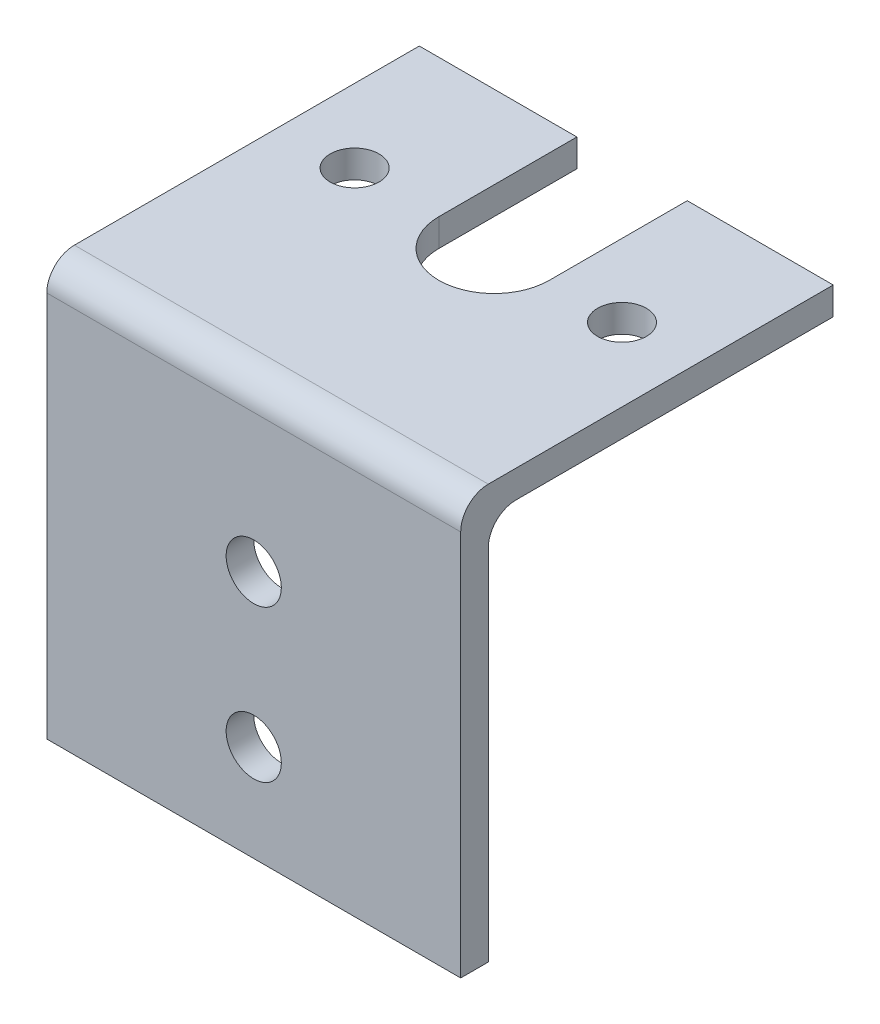
ISO-10303-21;
HEADER;
FILE_DESCRIPTION(('STEP AP214'),'2;1');
FILE_NAME('part.step','',(''),(''),'','','');
FILE_SCHEMA(('AUTOMOTIVE_DESIGN { 1 0 10303 214 1 1 1 1 }'));
ENDSEC;
DATA;
#1=APPLICATION_CONTEXT('core data for automotive mechanical design processes');
#2=APPLICATION_PROTOCOL_DEFINITION('international standard','automotive_design',2000,#1);
#3=PRODUCT_CONTEXT('',#1,'mechanical');
#4=PRODUCT('Part','Part','',(#3));
#5=PRODUCT_RELATED_PRODUCT_CATEGORY('part','',(#4));
#6=PRODUCT_DEFINITION_FORMATION('','',#4);
#7=PRODUCT_DEFINITION_CONTEXT('part definition',#1,'design');
#8=PRODUCT_DEFINITION('design','',#6,#7);
#9=PRODUCT_DEFINITION_SHAPE('','',#8);
#10=(LENGTH_UNIT() NAMED_UNIT(*) SI_UNIT(.MILLI.,.METRE.));
#11=(NAMED_UNIT(*) PLANE_ANGLE_UNIT() SI_UNIT($,.RADIAN.));
#12=(NAMED_UNIT(*) SI_UNIT($,.STERADIAN.) SOLID_ANGLE_UNIT());
#13=UNCERTAINTY_MEASURE_WITH_UNIT(LENGTH_MEASURE(1.E-05),#10,'distance_accuracy_value','');
#14=(GEOMETRIC_REPRESENTATION_CONTEXT(3) GLOBAL_UNCERTAINTY_ASSIGNED_CONTEXT((#13)) GLOBAL_UNIT_ASSIGNED_CONTEXT((#10,
#11,#12)) REPRESENTATION_CONTEXT('',''));
#15=CARTESIAN_POINT('',(0.,0.,0.));
#16=DIRECTION('',(0.,0.,1.));
#17=DIRECTION('',(1.,0.,0.));
#18=AXIS2_PLACEMENT_3D('',#15,#16,#17);
#19=CARTESIAN_POINT('',(0.,2.54,0.));
#20=DIRECTION('',(0.,1.,0.));
#21=DIRECTION('',(0.,0.,1.));
#22=AXIS2_PLACEMENT_3D('',#19,#20,#21);
#23=PLANE('',#22);
#24=CARTESIAN_POINT('',(-12.8396640387052,2.54,-4.07076813519034));
#25=DIRECTION('',(0.,1.,0.));
#26=DIRECTION('',(0.,0.,1.));
#27=AXIS2_PLACEMENT_3D('',#24,#25,#26);
#28=CIRCLE('',#27,2.24790000000002);
#29=CARTESIAN_POINT('',(-12.8396640387052,2.54,-1.82286813519033));
#30=VERTEX_POINT('',#29);
#31=EDGE_CURVE('E168',#30,#30,#28,.T.);
#32=ORIENTED_EDGE('',*,*,#31,.F.);
#33=EDGE_LOOP('',(#32));
#34=FACE_BOUND('',#33,.T.);
#35=DIRECTION('',(0.,0.,1.));
#36=VECTOR('',#35,1.);
#37=CARTESIAN_POINT('',(-19.5833640387052,2.54,-16.7707681351903));
#38=LINE('',#37,#36);
#39=CARTESIAN_POINT('',(-19.5833640387052,2.54,-16.7707681351903));
#40=VERTEX_POINT('',#39);
#41=CARTESIAN_POINT('',(-19.5833640387052,2.54,14.9792318648097));
#42=VERTEX_POINT('',#41);
#43=EDGE_CURVE('E186',#40,#42,#38,.T.);
#44=ORIENTED_EDGE('',*,*,#43,.T.);
#45=DIRECTION('',(-1.,0.,0.));
#46=VECTOR('',#45,1.);
#47=CARTESIAN_POINT('',(0.,2.54,14.9792318648097));
#48=LINE('',#47,#46);
#49=CARTESIAN_POINT('',(18.5166359612948,2.54,14.9792318648097));
#50=VERTEX_POINT('',#49);
#51=EDGE_CURVE('E44',#42,#50,#48,.F.);
#52=ORIENTED_EDGE('',*,*,#51,.T.);
#53=DIRECTION('',(0.,0.,-1.));
#54=VECTOR('',#53,1.);
#55=CARTESIAN_POINT('',(18.5166359612948,2.54,-16.7707681351903));
#56=LINE('',#55,#54);
#57=CARTESIAN_POINT('',(18.5166359612948,2.54,-16.7707681351903));
#58=VERTEX_POINT('',#57);
#59=EDGE_CURVE('E174',#50,#58,#56,.T.);
#60=ORIENTED_EDGE('',*,*,#59,.T.);
#61=DIRECTION('',(-1.,0.,0.));
#62=VECTOR('',#61,1.);
#63=CARTESIAN_POINT('',(5.08,2.54,-16.7707681351903));
#64=LINE('',#63,#62);
#65=CARTESIAN_POINT('',(5.08,2.54,-16.7707681351903));
#66=VERTEX_POINT('',#65);
#67=EDGE_CURVE('E176',#58,#66,#64,.T.);
#68=ORIENTED_EDGE('',*,*,#67,.T.);
#69=DIRECTION('',(0.,0.,1.));
#70=VECTOR('',#69,1.);
#71=CARTESIAN_POINT('',(5.08,2.54,1.00923186480966));
#72=LINE('',#71,#70);
#73=CARTESIAN_POINT('',(5.08,2.54,-4.07076813519034));
#74=VERTEX_POINT('',#73);
#75=EDGE_CURVE('E179',#66,#74,#72,.T.);
#76=ORIENTED_EDGE('',*,*,#75,.T.);
#77=CARTESIAN_POINT('',(0.,2.54,-4.07076813519034));
#78=DIRECTION('',(0.,1.,0.));
#79=DIRECTION('',(0.,0.,1.));
#80=AXIS2_PLACEMENT_3D('',#77,#78,#79);
#81=CIRCLE('',#80,5.08);
#82=CARTESIAN_POINT('',(0.,2.54,1.00923186480966));
#83=VERTEX_POINT('',#82);
#84=EDGE_CURVE('E219',#74,#83,#81,.F.);
#85=ORIENTED_EDGE('',*,*,#84,.T.);
#86=CARTESIAN_POINT('',(0.,2.54,-4.07076813519034));
#87=DIRECTION('',(0.,1.,0.));
#88=DIRECTION('',(0.,0.,1.));
#89=AXIS2_PLACEMENT_3D('',#86,#87,#88);
#90=CIRCLE('',#89,5.08);
#91=CARTESIAN_POINT('',(-5.08,2.54,-4.07076813519034));
#92=VERTEX_POINT('',#91);
#93=EDGE_CURVE('E223',#83,#92,#90,.F.);
#94=ORIENTED_EDGE('',*,*,#93,.T.);
#95=DIRECTION('',(0.,0.,-1.));
#96=VECTOR('',#95,1.);
#97=CARTESIAN_POINT('',(-5.08,2.54,1.00923186480966));
#98=LINE('',#97,#96);
#99=CARTESIAN_POINT('',(-5.08,2.54,-16.7707681351903));
#100=VERTEX_POINT('',#99);
#101=EDGE_CURVE('E182',#92,#100,#98,.T.);
#102=ORIENTED_EDGE('',*,*,#101,.T.);
#103=DIRECTION('',(-1.,0.,0.));
#104=VECTOR('',#103,1.);
#105=CARTESIAN_POINT('',(-19.5833640387052,2.54,-16.7707681351903));
#106=LINE('',#105,#104);
#107=EDGE_CURVE('E184',#100,#40,#106,.T.);
#108=ORIENTED_EDGE('',*,*,#107,.T.);
#109=EDGE_LOOP('',(#44,#52,#60,#68,#76,#85,#94,#102,#108));
#110=FACE_BOUND('',#109,.T.);
#111=CARTESIAN_POINT('',(11.7729359612948,2.54,-4.07076813519034));
#112=DIRECTION('',(0.,1.,0.));
#113=DIRECTION('',(0.,0.,1.));
#114=AXIS2_PLACEMENT_3D('',#111,#112,#113);
#115=CIRCLE('',#114,2.2479);
#116=CARTESIAN_POINT('',(11.7729359612948,2.54,-1.82286813519034));
#117=VERTEX_POINT('',#116);
#118=EDGE_CURVE('E162',#117,#117,#115,.T.);
#119=ORIENTED_EDGE('',*,*,#118,.F.);
#120=EDGE_LOOP('',(#119));
#121=FACE_BOUND('',#120,.T.);
#122=ADVANCED_FACE('F36',(#34,#110,#121),#23,.T.);
#123=CARTESIAN_POINT('',(0.,0.,0.));
#124=DIRECTION('',(0.,1.,0.));
#125=DIRECTION('',(0.,0.,1.));
#126=AXIS2_PLACEMENT_3D('',#123,#124,#125);
#127=PLANE('',#126);
#128=DIRECTION('',(0.,0.,-1.));
#129=VECTOR('',#128,1.);
#130=CARTESIAN_POINT('',(18.5166359612948,0.,-16.7707681351903));
#131=LINE('',#130,#129);
#132=CARTESIAN_POINT('',(18.5166359612948,0.,12.4392318648097));
#133=VERTEX_POINT('',#132);
#134=CARTESIAN_POINT('',(18.5166359612948,0.,-16.7707681351903));
#135=VERTEX_POINT('',#134);
#136=EDGE_CURVE('E171',#133,#135,#131,.T.);
#137=ORIENTED_EDGE('',*,*,#136,.F.);
#138=DIRECTION('',(1.,0.,0.));
#139=VECTOR('',#138,1.);
#140=CARTESIAN_POINT('',(-19.5833640387052,0.,12.4392318648097));
#141=LINE('',#140,#139);
#142=CARTESIAN_POINT('',(-19.5833640387052,0.,12.4392318648097));
#143=VERTEX_POINT('',#142);
#144=EDGE_CURVE('E228',#133,#143,#141,.F.);
#145=ORIENTED_EDGE('',*,*,#144,.T.);
#146=DIRECTION('',(0.,0.,1.));
#147=VECTOR('',#146,1.);
#148=CARTESIAN_POINT('',(-19.5833640387052,0.,-16.7707681351903));
#149=LINE('',#148,#147);
#150=CARTESIAN_POINT('',(-19.5833640387052,0.,-16.7707681351903));
#151=VERTEX_POINT('',#150);
#152=EDGE_CURVE('E177',#151,#143,#149,.T.);
#153=ORIENTED_EDGE('',*,*,#152,.F.);
#154=DIRECTION('',(-1.,0.,0.));
#155=VECTOR('',#154,1.);
#156=CARTESIAN_POINT('',(-19.5833640387052,0.,-16.7707681351903));
#157=LINE('',#156,#155);
#158=CARTESIAN_POINT('',(-5.08,0.,-16.7707681351903));
#159=VERTEX_POINT('',#158);
#160=EDGE_CURVE('E197',#159,#151,#157,.T.);
#161=ORIENTED_EDGE('',*,*,#160,.F.);
#162=DIRECTION('',(0.,0.,-1.));
#163=VECTOR('',#162,1.);
#164=CARTESIAN_POINT('',(-5.08,0.,1.00923186480966));
#165=LINE('',#164,#163);
#166=CARTESIAN_POINT('',(-5.08,0.,-4.07076813519034));
#167=VERTEX_POINT('',#166);
#168=EDGE_CURVE('E195',#167,#159,#165,.T.);
#169=ORIENTED_EDGE('',*,*,#168,.F.);
#170=CARTESIAN_POINT('',(0.,0.,-4.07076813519034));
#171=DIRECTION('',(0.,1.,0.));
#172=DIRECTION('',(0.,0.,1.));
#173=AXIS2_PLACEMENT_3D('',#170,#171,#172);
#174=CIRCLE('',#173,5.08);
#175=CARTESIAN_POINT('',(0.,0.,1.00923186480966));
#176=VERTEX_POINT('',#175);
#177=EDGE_CURVE('E221',#167,#176,#174,.T.);
#178=ORIENTED_EDGE('',*,*,#177,.T.);
#179=CARTESIAN_POINT('',(0.,0.,-4.07076813519034));
#180=DIRECTION('',(0.,1.,0.));
#181=DIRECTION('',(0.,0.,1.));
#182=AXIS2_PLACEMENT_3D('',#179,#180,#181);
#183=CIRCLE('',#182,5.08);
#184=CARTESIAN_POINT('',(5.08,0.,-4.07076813519034));
#185=VERTEX_POINT('',#184);
#186=EDGE_CURVE('E217',#176,#185,#183,.T.);
#187=ORIENTED_EDGE('',*,*,#186,.T.);
#188=DIRECTION('',(0.,0.,1.));
#189=VECTOR('',#188,1.);
#190=CARTESIAN_POINT('',(5.08,0.,1.00923186480966));
#191=LINE('',#190,#189);
#192=CARTESIAN_POINT('',(5.08,0.,-16.7707681351903));
#193=VERTEX_POINT('',#192);
#194=EDGE_CURVE('E192',#193,#185,#191,.T.);
#195=ORIENTED_EDGE('',*,*,#194,.F.);
#196=DIRECTION('',(-1.,0.,0.));
#197=VECTOR('',#196,1.);
#198=CARTESIAN_POINT('',(5.08,0.,-16.7707681351903));
#199=LINE('',#198,#197);
#200=EDGE_CURVE('E190',#135,#193,#199,.T.);
#201=ORIENTED_EDGE('',*,*,#200,.F.);
#202=EDGE_LOOP('',(#137,#145,#153,#161,#169,#178,#187,#195,#201));
#203=FACE_BOUND('',#202,.T.);
#204=CARTESIAN_POINT('',(-12.8396640387052,0.,-4.07076813519034));
#205=DIRECTION('',(0.,1.,0.));
#206=DIRECTION('',(0.,0.,1.));
#207=AXIS2_PLACEMENT_3D('',#204,#205,#206);
#208=CIRCLE('',#207,2.24790000000002);
#209=CARTESIAN_POINT('',(-12.8396640387052,0.,-1.82286813519033));
#210=VERTEX_POINT('',#209);
#211=EDGE_CURVE('E165',#210,#210,#208,.T.);
#212=ORIENTED_EDGE('',*,*,#211,.T.);
#213=EDGE_LOOP('',(#212));
#214=FACE_BOUND('',#213,.T.);
#215=CARTESIAN_POINT('',(11.7729359612948,0.,-4.07076813519034));
#216=DIRECTION('',(0.,1.,0.));
#217=DIRECTION('',(0.,0.,1.));
#218=AXIS2_PLACEMENT_3D('',#215,#216,#217);
#219=CIRCLE('',#218,2.2479);
#220=CARTESIAN_POINT('',(11.7729359612948,0.,-1.82286813519034));
#221=VERTEX_POINT('',#220);
#222=EDGE_CURVE('E157',#221,#221,#219,.T.);
#223=ORIENTED_EDGE('',*,*,#222,.T.);
#224=EDGE_LOOP('',(#223));
#225=FACE_BOUND('',#224,.T.);
#226=ADVANCED_FACE('F254',(#203,#214,#225),#127,.F.);
#227=CARTESIAN_POINT('',(18.5166359612948,2.54,-16.7707681351903));
#228=DIRECTION('',(-1.,0.,0.));
#229=DIRECTION('',(0.,0.,1.));
#230=AXIS2_PLACEMENT_3D('',#227,#228,#229);
#231=PLANE('',#230);
#232=ORIENTED_EDGE('',*,*,#59,.F.);
#233=CARTESIAN_POINT('',(18.5166359612948,0.,14.9792318648097));
#234=DIRECTION('',(-1.,0.,0.));
#235=DIRECTION('',(0.,0.,1.));
#236=AXIS2_PLACEMENT_3D('',#233,#234,#235);
#237=CIRCLE('',#236,2.54);
#238=CARTESIAN_POINT('',(18.5166359612948,0.,17.5192318648097));
#239=VERTEX_POINT('',#238);
#240=EDGE_CURVE('E11',#50,#239,#237,.F.);
#241=ORIENTED_EDGE('',*,*,#240,.T.);
#242=DIRECTION('',(0.,1.,0.));
#243=VECTOR('',#242,1.);
#244=CARTESIAN_POINT('',(18.5166359612948,2.54,17.5192318648097));
#245=LINE('',#244,#243);
#246=CARTESIAN_POINT('',(18.5166359612948,-35.56,17.5192318648097));
#247=VERTEX_POINT('',#246);
#248=EDGE_CURVE('E148',#247,#239,#245,.T.);
#249=ORIENTED_EDGE('',*,*,#248,.F.);
#250=DIRECTION('',(0.,0.,-1.));
#251=VECTOR('',#250,1.);
#252=CARTESIAN_POINT('',(18.5166359612948,-35.56,17.5192318648097));
#253=LINE('',#252,#251);
#254=CARTESIAN_POINT('',(18.5166359612948,-35.56,14.9792318648097));
#255=VERTEX_POINT('',#254);
#256=EDGE_CURVE('E146',#247,#255,#253,.T.);
#257=ORIENTED_EDGE('',*,*,#256,.T.);
#258=DIRECTION('',(0.,1.,0.));
#259=VECTOR('',#258,1.);
#260=CARTESIAN_POINT('',(18.5166359612948,2.54,14.9792318648097));
#261=LINE('',#260,#259);
#262=CARTESIAN_POINT('',(18.5166359612948,-2.54,14.9792318648097));
#263=VERTEX_POINT('',#262);
#264=EDGE_CURVE('E139',#255,#263,#261,.T.);
#265=ORIENTED_EDGE('',*,*,#264,.T.);
#266=CARTESIAN_POINT('',(18.5166359612948,-2.54,12.4392318648097));
#267=DIRECTION('',(-1.,0.,0.));
#268=DIRECTION('',(0.,0.,1.));
#269=AXIS2_PLACEMENT_3D('',#266,#267,#268);
#270=CIRCLE('',#269,2.54);
#271=EDGE_CURVE('E230',#263,#133,#270,.T.);
#272=ORIENTED_EDGE('',*,*,#271,.T.);
#273=ORIENTED_EDGE('',*,*,#136,.T.);
#274=DIRECTION('',(0.,-1.,0.));
#275=VECTOR('',#274,1.);
#276=CARTESIAN_POINT('',(18.5166359612948,2.54,-16.7707681351903));
#277=LINE('',#276,#275);
#278=EDGE_CURVE('E209',#58,#135,#277,.T.);
#279=ORIENTED_EDGE('',*,*,#278,.F.);
#280=EDGE_LOOP('',(#232,#241,#249,#257,#265,#272,#273,#279));
#281=FACE_BOUND('',#280,.T.);
#282=ADVANCED_FACE('F250',(#281),#231,.F.);
#283=CARTESIAN_POINT('',(5.08,2.54,-16.7707681351903));
#284=DIRECTION('',(0.,0.,1.));
#285=DIRECTION('',(1.,0.,0.));
#286=AXIS2_PLACEMENT_3D('',#283,#284,#285);
#287=PLANE('',#286);
#288=ORIENTED_EDGE('',*,*,#200,.T.);
#289=DIRECTION('',(0.,-1.,0.));
#290=VECTOR('',#289,1.);
#291=CARTESIAN_POINT('',(5.08,2.54,-16.7707681351903));
#292=LINE('',#291,#290);
#293=EDGE_CURVE('E206',#66,#193,#292,.T.);
#294=ORIENTED_EDGE('',*,*,#293,.F.);
#295=ORIENTED_EDGE('',*,*,#67,.F.);
#296=ORIENTED_EDGE('',*,*,#278,.T.);
#297=EDGE_LOOP('',(#288,#294,#295,#296));
#298=FACE_BOUND('',#297,.T.);
#299=ADVANCED_FACE('F260',(#298),#287,.F.);
#300=CARTESIAN_POINT('',(5.08,2.54,1.00923186480966));
#301=DIRECTION('',(1.,0.,0.));
#302=DIRECTION('',(0.,0.,-1.));
#303=AXIS2_PLACEMENT_3D('',#300,#301,#302);
#304=PLANE('',#303);
#305=ORIENTED_EDGE('',*,*,#194,.T.);
#306=DIRECTION('',(0.,-1.,0.));
#307=VECTOR('',#306,1.);
#308=CARTESIAN_POINT('',(5.08,2.54,-4.07076813519034));
#309=LINE('',#308,#307);
#310=EDGE_CURVE('E212',#185,#74,#309,.F.);
#311=ORIENTED_EDGE('',*,*,#310,.T.);
#312=ORIENTED_EDGE('',*,*,#75,.F.);
#313=ORIENTED_EDGE('',*,*,#293,.T.);
#314=EDGE_LOOP('',(#305,#311,#312,#313));
#315=FACE_BOUND('',#314,.T.);
#316=ADVANCED_FACE('F289',(#315),#304,.F.);
#317=CARTESIAN_POINT('',(-5.08,2.54,1.00923186480966));
#318=DIRECTION('',(-1.,0.,0.));
#319=DIRECTION('',(0.,0.,1.));
#320=AXIS2_PLACEMENT_3D('',#317,#318,#319);
#321=PLANE('',#320);
#322=ORIENTED_EDGE('',*,*,#101,.F.);
#323=DIRECTION('',(0.,-1.,0.));
#324=VECTOR('',#323,1.);
#325=CARTESIAN_POINT('',(-5.08,0.,-4.07076813519034));
#326=LINE('',#325,#324);
#327=EDGE_CURVE('E215',#92,#167,#326,.T.);
#328=ORIENTED_EDGE('',*,*,#327,.T.);
#329=ORIENTED_EDGE('',*,*,#168,.T.);
#330=DIRECTION('',(0.,-1.,0.));
#331=VECTOR('',#330,1.);
#332=CARTESIAN_POINT('',(-5.08,2.54,-16.7707681351903));
#333=LINE('',#332,#331);
#334=EDGE_CURVE('E203',#100,#159,#333,.T.);
#335=ORIENTED_EDGE('',*,*,#334,.F.);
#336=EDGE_LOOP('',(#322,#328,#329,#335));
#337=FACE_BOUND('',#336,.T.);
#338=ADVANCED_FACE('F285',(#337),#321,.F.);
#339=CARTESIAN_POINT('',(-19.5833640387052,2.54,-16.7707681351903));
#340=DIRECTION('',(0.,0.,1.));
#341=DIRECTION('',(1.,0.,0.));
#342=AXIS2_PLACEMENT_3D('',#339,#340,#341);
#343=PLANE('',#342);
#344=ORIENTED_EDGE('',*,*,#160,.T.);
#345=DIRECTION('',(0.,-1.,0.));
#346=VECTOR('',#345,1.);
#347=CARTESIAN_POINT('',(-19.5833640387052,2.54,-16.7707681351903));
#348=LINE('',#347,#346);
#349=EDGE_CURVE('E188',#40,#151,#348,.T.);
#350=ORIENTED_EDGE('',*,*,#349,.F.);
#351=ORIENTED_EDGE('',*,*,#107,.F.);
#352=ORIENTED_EDGE('',*,*,#334,.T.);
#353=EDGE_LOOP('',(#344,#350,#351,#352));
#354=FACE_BOUND('',#353,.T.);
#355=ADVANCED_FACE('F282',(#354),#343,.F.);
#356=CARTESIAN_POINT('',(-19.5833640387052,2.54,-16.7707681351903));
#357=DIRECTION('',(1.,0.,0.));
#358=DIRECTION('',(0.,0.,-1.));
#359=AXIS2_PLACEMENT_3D('',#356,#357,#358);
#360=PLANE('',#359);
#361=DIRECTION('',(0.,-1.,0.));
#362=VECTOR('',#361,1.);
#363=CARTESIAN_POINT('',(-19.5833640387052,2.54,17.5192318648097));
#364=LINE('',#363,#362);
#365=CARTESIAN_POINT('',(-19.5833640387052,0.,17.5192318648097));
#366=VERTEX_POINT('',#365);
#367=CARTESIAN_POINT('',(-19.5833640387052,-35.56,17.5192318648097));
#368=VERTEX_POINT('',#367);
#369=EDGE_CURVE('E129',#366,#368,#364,.T.);
#370=ORIENTED_EDGE('',*,*,#369,.F.);
#371=CARTESIAN_POINT('',(-19.5833640387052,0.,14.9792318648097));
#372=DIRECTION('',(1.,0.,0.));
#373=DIRECTION('',(0.,0.,-1.));
#374=AXIS2_PLACEMENT_3D('',#371,#372,#373);
#375=CIRCLE('',#374,2.54);
#376=EDGE_CURVE('E58',#366,#42,#375,.F.);
#377=ORIENTED_EDGE('',*,*,#376,.T.);
#378=ORIENTED_EDGE('',*,*,#43,.F.);
#379=ORIENTED_EDGE('',*,*,#349,.T.);
#380=ORIENTED_EDGE('',*,*,#152,.T.);
#381=CARTESIAN_POINT('',(-19.5833640387052,-2.54,12.4392318648097));
#382=DIRECTION('',(1.,0.,0.));
#383=DIRECTION('',(0.,0.,-1.));
#384=AXIS2_PLACEMENT_3D('',#381,#382,#383);
#385=CIRCLE('',#384,2.54);
#386=CARTESIAN_POINT('',(-19.5833640387052,-2.54,14.9792318648097));
#387=VERTEX_POINT('',#386);
#388=EDGE_CURVE('E232',#143,#387,#385,.T.);
#389=ORIENTED_EDGE('',*,*,#388,.T.);
#390=DIRECTION('',(0.,-1.,0.));
#391=VECTOR('',#390,1.);
#392=CARTESIAN_POINT('',(-19.5833640387052,2.54,14.9792318648097));
#393=LINE('',#392,#391);
#394=CARTESIAN_POINT('',(-19.5833640387052,-35.56,14.9792318648097));
#395=VERTEX_POINT('',#394);
#396=EDGE_CURVE('E152',#387,#395,#393,.T.);
#397=ORIENTED_EDGE('',*,*,#396,.T.);
#398=DIRECTION('',(0.,0.,-1.));
#399=VECTOR('',#398,1.);
#400=CARTESIAN_POINT('',(-19.5833640387052,-35.56,17.5192318648097));
#401=LINE('',#400,#399);
#402=EDGE_CURVE('E144',#368,#395,#401,.T.);
#403=ORIENTED_EDGE('',*,*,#402,.F.);
#404=EDGE_LOOP('',(#370,#377,#378,#379,#380,#389,#397,#403));
#405=FACE_BOUND('',#404,.T.);
#406=ADVANCED_FACE('F150',(#405),#360,.F.);
#407=CARTESIAN_POINT('',(-12.8396640387052,2.54,-4.07076813519034));
#408=DIRECTION('',(0.,-1.,0.));
#409=DIRECTION('',(0.,0.,-1.));
#410=AXIS2_PLACEMENT_3D('',#407,#408,#409);
#411=CYLINDRICAL_SURFACE('',#410,2.24790000000002);
#412=ORIENTED_EDGE('',*,*,#31,.T.);
#413=EDGE_LOOP('',(#412));
#414=FACE_BOUND('',#413,.T.);
#415=ORIENTED_EDGE('',*,*,#211,.F.);
#416=EDGE_LOOP('',(#415));
#417=FACE_BOUND('',#416,.T.);
#418=ADVANCED_FACE('F277',(#414,#417),#411,.F.);
#419=CARTESIAN_POINT('',(11.7729359612948,2.54,-4.07076813519034));
#420=DIRECTION('',(0.,-1.,0.));
#421=DIRECTION('',(0.,0.,-1.));
#422=AXIS2_PLACEMENT_3D('',#419,#420,#421);
#423=CYLINDRICAL_SURFACE('',#422,2.2479);
#424=ORIENTED_EDGE('',*,*,#118,.T.);
#425=EDGE_LOOP('',(#424));
#426=FACE_BOUND('',#425,.T.);
#427=ORIENTED_EDGE('',*,*,#222,.F.);
#428=EDGE_LOOP('',(#427));
#429=FACE_BOUND('',#428,.T.);
#430=ADVANCED_FACE('F304',(#426,#429),#423,.F.);
#431=CARTESIAN_POINT('',(0.,2.54,-4.07076813519034));
#432=DIRECTION('',(0.,1.,0.));
#433=DIRECTION('',(0.,0.,1.));
#434=AXIS2_PLACEMENT_3D('',#431,#432,#433);
#435=CYLINDRICAL_SURFACE('',#434,5.08);
#436=ORIENTED_EDGE('',*,*,#327,.F.);
#437=ORIENTED_EDGE('',*,*,#93,.F.);
#438=DIRECTION('',(0.,-1.,0.));
#439=VECTOR('',#438,1.);
#440=CARTESIAN_POINT('',(0.,2.54,1.00923186480966));
#441=LINE('',#440,#439);
#442=EDGE_CURVE('E154',#176,#83,#441,.F.);
#443=ORIENTED_EDGE('',*,*,#442,.F.);
#444=ORIENTED_EDGE('',*,*,#177,.F.);
#445=EDGE_LOOP('',(#436,#437,#443,#444));
#446=FACE_BOUND('',#445,.T.);
#447=ADVANCED_FACE('F301',(#446),#435,.F.);
#448=CARTESIAN_POINT('',(0.,2.54,-4.07076813519034));
#449=DIRECTION('',(0.,1.,0.));
#450=DIRECTION('',(0.,0.,1.));
#451=AXIS2_PLACEMENT_3D('',#448,#449,#450);
#452=CYLINDRICAL_SURFACE('',#451,5.08);
#453=ORIENTED_EDGE('',*,*,#84,.F.);
#454=ORIENTED_EDGE('',*,*,#310,.F.);
#455=ORIENTED_EDGE('',*,*,#186,.F.);
#456=ORIENTED_EDGE('',*,*,#442,.T.);
#457=EDGE_LOOP('',(#453,#454,#455,#456));
#458=FACE_BOUND('',#457,.T.);
#459=ADVANCED_FACE('F298',(#458),#452,.F.);
#460=CARTESIAN_POINT('',(0.,0.,14.9792318648097));
#461=DIRECTION('',(0.,0.,1.));
#462=DIRECTION('',(1.,0.,0.));
#463=AXIS2_PLACEMENT_3D('',#460,#461,#462);
#464=PLANE('',#463);
#465=CARTESIAN_POINT('',(-0.533364038705207,-12.7,14.9792318648097));
#466=DIRECTION('',(0.,0.,1.));
#467=DIRECTION('',(1.,0.,0.));
#468=AXIS2_PLACEMENT_3D('',#465,#466,#467);
#469=CIRCLE('',#468,2.54);
#470=CARTESIAN_POINT('',(2.00663596129479,-12.7,14.9792318648097));
#471=VERTEX_POINT('',#470);
#472=EDGE_CURVE('E358',#471,#471,#469,.T.);
#473=ORIENTED_EDGE('',*,*,#472,.T.);
#474=EDGE_LOOP('',(#473));
#475=FACE_BOUND('',#474,.T.);
#476=CARTESIAN_POINT('',(-0.533364038705207,-26.67,14.9792318648097));
#477=DIRECTION('',(0.,0.,1.));
#478=DIRECTION('',(1.,0.,0.));
#479=AXIS2_PLACEMENT_3D('',#476,#477,#478);
#480=CIRCLE('',#479,2.54);
#481=CARTESIAN_POINT('',(2.0066359612948,-26.67,14.9792318648097));
#482=VERTEX_POINT('',#481);
#483=EDGE_CURVE('E355',#482,#482,#480,.T.);
#484=ORIENTED_EDGE('',*,*,#483,.T.);
#485=EDGE_LOOP('',(#484));
#486=FACE_BOUND('',#485,.T.);
#487=ORIENTED_EDGE('',*,*,#396,.F.);
#488=DIRECTION('',(1.,0.,0.));
#489=VECTOR('',#488,1.);
#490=CARTESIAN_POINT('',(18.5166359612948,-2.54,14.9792318648097));
#491=LINE('',#490,#489);
#492=EDGE_CURVE('E224',#387,#263,#491,.T.);
#493=ORIENTED_EDGE('',*,*,#492,.T.);
#494=ORIENTED_EDGE('',*,*,#264,.F.);
#495=DIRECTION('',(1.,0.,0.));
#496=VECTOR('',#495,1.);
#497=CARTESIAN_POINT('',(-19.5833640387052,-35.56,14.9792318648097));
#498=LINE('',#497,#496);
#499=EDGE_CURVE('E244',#395,#255,#498,.T.);
#500=ORIENTED_EDGE('',*,*,#499,.F.);
#501=EDGE_LOOP('',(#487,#493,#494,#500));
#502=FACE_BOUND('',#501,.T.);
#503=ADVANCED_FACE('F241',(#475,#486,#502),#464,.F.);
#504=CARTESIAN_POINT('',(0.,0.,17.5192318648097));
#505=DIRECTION('',(0.,0.,1.));
#506=DIRECTION('',(1.,0.,0.));
#507=AXIS2_PLACEMENT_3D('',#504,#505,#506);
#508=PLANE('',#507);
#509=CARTESIAN_POINT('',(-0.533364038705207,-12.7,17.5192318648097));
#510=DIRECTION('',(0.,0.,1.));
#511=DIRECTION('',(1.,0.,0.));
#512=AXIS2_PLACEMENT_3D('',#509,#510,#511);
#513=CIRCLE('',#512,2.54);
#514=CARTESIAN_POINT('',(2.00663596129479,-12.7,17.5192318648097));
#515=VERTEX_POINT('',#514);
#516=EDGE_CURVE('E245',#515,#515,#513,.T.);
#517=ORIENTED_EDGE('',*,*,#516,.F.);
#518=EDGE_LOOP('',(#517));
#519=FACE_BOUND('',#518,.T.);
#520=ORIENTED_EDGE('',*,*,#248,.T.);
#521=DIRECTION('',(-1.,0.,0.));
#522=VECTOR('',#521,1.);
#523=CARTESIAN_POINT('',(0.,0.,17.5192318648097));
#524=LINE('',#523,#522);
#525=EDGE_CURVE('E137',#239,#366,#524,.T.);
#526=ORIENTED_EDGE('',*,*,#525,.T.);
#527=ORIENTED_EDGE('',*,*,#369,.T.);
#528=DIRECTION('',(1.,0.,0.));
#529=VECTOR('',#528,1.);
#530=CARTESIAN_POINT('',(-19.5833640387052,-35.56,17.5192318648097));
#531=LINE('',#530,#529);
#532=EDGE_CURVE('E134',#368,#247,#531,.T.);
#533=ORIENTED_EDGE('',*,*,#532,.T.);
#534=EDGE_LOOP('',(#520,#526,#527,#533));
#535=FACE_BOUND('',#534,.T.);
#536=CARTESIAN_POINT('',(-0.533364038705207,-26.67,17.5192318648097));
#537=DIRECTION('',(0.,0.,1.));
#538=DIRECTION('',(1.,0.,0.));
#539=AXIS2_PLACEMENT_3D('',#536,#537,#538);
#540=CIRCLE('',#539,2.54);
#541=CARTESIAN_POINT('',(2.0066359612948,-26.67,17.5192318648097));
#542=VERTEX_POINT('',#541);
#543=EDGE_CURVE('E352',#542,#542,#540,.T.);
#544=ORIENTED_EDGE('',*,*,#543,.F.);
#545=EDGE_LOOP('',(#544));
#546=FACE_BOUND('',#545,.T.);
#547=ADVANCED_FACE('F132',(#519,#535,#546),#508,.T.);
#548=CARTESIAN_POINT('',(-19.5833640387052,-35.56,17.5192318648097));
#549=DIRECTION('',(0.,1.,0.));
#550=DIRECTION('',(-1.,0.,0.));
#551=AXIS2_PLACEMENT_3D('',#548,#549,#550);
#552=PLANE('',#551);
#553=ORIENTED_EDGE('',*,*,#499,.T.);
#554=ORIENTED_EDGE('',*,*,#256,.F.);
#555=ORIENTED_EDGE('',*,*,#532,.F.);
#556=ORIENTED_EDGE('',*,*,#402,.T.);
#557=EDGE_LOOP('',(#553,#554,#555,#556));
#558=FACE_BOUND('',#557,.T.);
#559=ADVANCED_FACE('F143',(#558),#552,.F.);
#560=CARTESIAN_POINT('',(-0.533364038705207,-12.7,17.5192318648097));
#561=DIRECTION('',(0.,0.,-1.));
#562=DIRECTION('',(-1.,0.,0.));
#563=AXIS2_PLACEMENT_3D('',#560,#561,#562);
#564=CYLINDRICAL_SURFACE('',#563,2.54);
#565=ORIENTED_EDGE('',*,*,#516,.T.);
#566=EDGE_LOOP('',(#565));
#567=FACE_BOUND('',#566,.T.);
#568=ORIENTED_EDGE('',*,*,#472,.F.);
#569=EDGE_LOOP('',(#568));
#570=FACE_BOUND('',#569,.T.);
#571=ADVANCED_FACE('F335',(#567,#570),#564,.F.);
#572=CARTESIAN_POINT('',(-0.533364038705207,-26.67,17.5192318648097));
#573=DIRECTION('',(0.,0.,-1.));
#574=DIRECTION('',(-1.,0.,0.));
#575=AXIS2_PLACEMENT_3D('',#572,#573,#574);
#576=CYLINDRICAL_SURFACE('',#575,2.54);
#577=ORIENTED_EDGE('',*,*,#543,.T.);
#578=EDGE_LOOP('',(#577));
#579=FACE_BOUND('',#578,.T.);
#580=ORIENTED_EDGE('',*,*,#483,.F.);
#581=EDGE_LOOP('',(#580));
#582=FACE_BOUND('',#581,.T.);
#583=ADVANCED_FACE('F267',(#579,#582),#576,.F.);
#584=CARTESIAN_POINT('',(0.,-2.54,12.4392318648097));
#585=DIRECTION('',(-1.,0.,0.));
#586=DIRECTION('',(0.,0.,1.));
#587=AXIS2_PLACEMENT_3D('',#584,#585,#586);
#588=CYLINDRICAL_SURFACE('',#587,2.54);
#589=ORIENTED_EDGE('',*,*,#388,.F.);
#590=ORIENTED_EDGE('',*,*,#144,.F.);
#591=ORIENTED_EDGE('',*,*,#271,.F.);
#592=ORIENTED_EDGE('',*,*,#492,.F.);
#593=EDGE_LOOP('',(#589,#590,#591,#592));
#594=FACE_BOUND('',#593,.T.);
#595=ADVANCED_FACE('F247',(#594),#588,.F.);
#596=CARTESIAN_POINT('',(0.,0.,14.9792318648097));
#597=DIRECTION('',(-1.,0.,0.));
#598=DIRECTION('',(0.,0.,1.));
#599=AXIS2_PLACEMENT_3D('',#596,#597,#598);
#600=CYLINDRICAL_SURFACE('',#599,2.54);
#601=ORIENTED_EDGE('',*,*,#240,.F.);
#602=ORIENTED_EDGE('',*,*,#51,.F.);
#603=ORIENTED_EDGE('',*,*,#376,.F.);
#604=ORIENTED_EDGE('',*,*,#525,.F.);
#605=EDGE_LOOP('',(#601,#602,#603,#604));
#606=FACE_BOUND('',#605,.T.);
#607=ADVANCED_FACE('F38',(#606),#600,.T.);
#608=CLOSED_SHELL('',(#122,#226,#282,#299,#316,#338,#355,#406,#418,#430,#447,#459,#503,#547,
#559,#571,#583,#595,#607));
#609=MANIFOLD_SOLID_BREP('B2',#608);
#610=ADVANCED_BREP_SHAPE_REPRESENTATION('',(#18,#609),#14);
#611=SHAPE_DEFINITION_REPRESENTATION(#9,#610);
ENDSEC;
END-ISO-10303-21;
